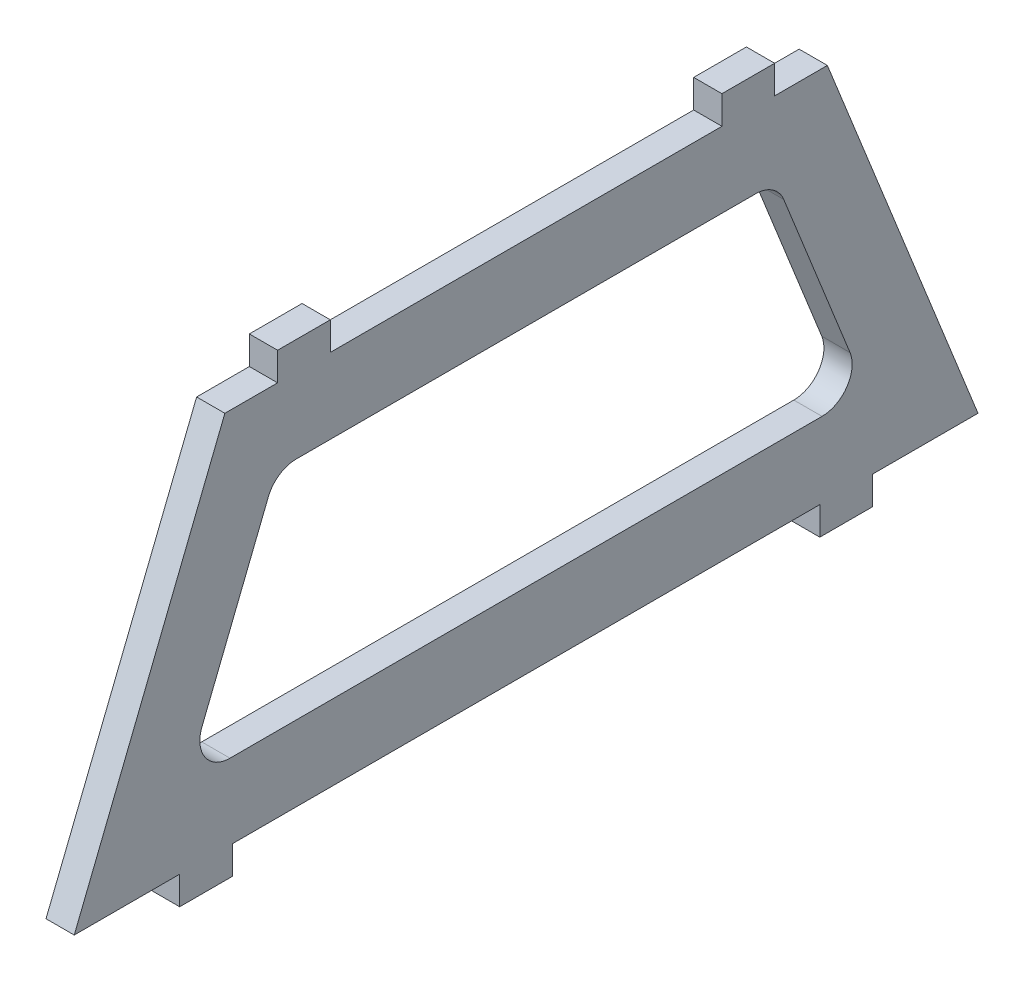
ISO-10303-21;
HEADER;
FILE_DESCRIPTION(('STEP AP214'),'2;1');
FILE_NAME('part.step','',(''),(''),'','','');
FILE_SCHEMA(('AUTOMOTIVE_DESIGN { 1 0 10303 214 1 1 1 1 }'));
ENDSEC;
DATA;
#1=APPLICATION_CONTEXT('core data for automotive mechanical design processes');
#2=APPLICATION_PROTOCOL_DEFINITION('international standard','automotive_design',2000,#1);
#3=PRODUCT_CONTEXT('',#1,'mechanical');
#4=PRODUCT('Part','Part','',(#3));
#5=PRODUCT_RELATED_PRODUCT_CATEGORY('part','',(#4));
#6=PRODUCT_DEFINITION_FORMATION('','',#4);
#7=PRODUCT_DEFINITION_CONTEXT('part definition',#1,'design');
#8=PRODUCT_DEFINITION('design','',#6,#7);
#9=PRODUCT_DEFINITION_SHAPE('','',#8);
#10=(LENGTH_UNIT() NAMED_UNIT(*) SI_UNIT(.MILLI.,.METRE.));
#11=(NAMED_UNIT(*) PLANE_ANGLE_UNIT() SI_UNIT($,.RADIAN.));
#12=(NAMED_UNIT(*) SI_UNIT($,.STERADIAN.) SOLID_ANGLE_UNIT());
#13=UNCERTAINTY_MEASURE_WITH_UNIT(LENGTH_MEASURE(1.E-05),#10,'distance_accuracy_value','');
#14=(GEOMETRIC_REPRESENTATION_CONTEXT(3) GLOBAL_UNCERTAINTY_ASSIGNED_CONTEXT((#13)) GLOBAL_UNIT_ASSIGNED_CONTEXT((#10,
#11,#12)) REPRESENTATION_CONTEXT('',''));
#15=CARTESIAN_POINT('',(0.,0.,0.));
#16=DIRECTION('',(0.,0.,1.));
#17=DIRECTION('',(1.,0.,0.));
#18=AXIS2_PLACEMENT_3D('',#15,#16,#17);
#19=CARTESIAN_POINT('',(4.7625,5.4030853865091E-13,92.7100000000004));
#20=DIRECTION('',(0.,0.,1.));
#21=DIRECTION('',(0.,-1.,0.));
#22=AXIS2_PLACEMENT_3D('',#19,#20,#21);
#23=PLANE('',#22);
#24=DIRECTION('',(0.,1.,0.));
#25=VECTOR('',#24,1.);
#26=CARTESIAN_POINT('',(0.,5.4030853865091E-13,92.7100000000004));
#27=LINE('',#26,#25);
#28=CARTESIAN_POINT('',(0.,63.5,92.71));
#29=VERTEX_POINT('',#28);
#30=CARTESIAN_POINT('',(0.,68.2625,92.71));
#31=VERTEX_POINT('',#30);
#32=EDGE_CURVE('E237',#29,#31,#27,.T.);
#33=ORIENTED_EDGE('',*,*,#32,.F.);
#34=DIRECTION('',(-1.,0.,0.));
#35=VECTOR('',#34,1.);
#36=CARTESIAN_POINT('',(4.7625,63.5,92.71));
#37=LINE('',#36,#35);
#38=CARTESIAN_POINT('',(4.7625,63.5,92.71));
#39=VERTEX_POINT('',#38);
#40=EDGE_CURVE('E231',#39,#29,#37,.T.);
#41=ORIENTED_EDGE('',*,*,#40,.F.);
#42=DIRECTION('',(0.,1.,0.));
#43=VECTOR('',#42,1.);
#44=CARTESIAN_POINT('',(4.7625,5.4030853865091E-13,92.7100000000004));
#45=LINE('',#44,#43);
#46=CARTESIAN_POINT('',(4.7625,68.2625,92.71));
#47=VERTEX_POINT('',#46);
#48=EDGE_CURVE('E234',#39,#47,#45,.T.);
#49=ORIENTED_EDGE('',*,*,#48,.T.);
#50=DIRECTION('',(-1.,0.,0.));
#51=VECTOR('',#50,1.);
#52=CARTESIAN_POINT('',(4.7625,68.2625,92.71));
#53=LINE('',#52,#51);
#54=EDGE_CURVE('E317',#47,#31,#53,.T.);
#55=ORIENTED_EDGE('',*,*,#54,.T.);
#56=EDGE_LOOP('',(#33,#41,#49,#55));
#57=FACE_BOUND('',#56,.T.);
#58=ADVANCED_FACE('F44',(#57),#23,.T.);
#59=CARTESIAN_POINT('',(4.7625,63.5,0.));
#60=DIRECTION('',(0.,-1.,0.));
#61=DIRECTION('',(0.,0.,-1.));
#62=AXIS2_PLACEMENT_3D('',#59,#60,#61);
#63=PLANE('',#62);
#64=DIRECTION('',(0.,0.,1.));
#65=VECTOR('',#64,1.);
#66=CARTESIAN_POINT('',(0.,63.5,0.));
#67=LINE('',#66,#65);
#68=CARTESIAN_POINT('',(0.,63.5,101.6));
#69=VERTEX_POINT('',#68);
#70=EDGE_CURVE('E320',#29,#69,#67,.T.);
#71=ORIENTED_EDGE('',*,*,#70,.T.);
#72=DIRECTION('',(-1.,0.,0.));
#73=VECTOR('',#72,1.);
#74=CARTESIAN_POINT('',(4.7625,63.5,101.6));
#75=LINE('',#74,#73);
#76=CARTESIAN_POINT('',(4.7625,63.5,101.6));
#77=VERTEX_POINT('',#76);
#78=EDGE_CURVE('E242',#77,#69,#75,.T.);
#79=ORIENTED_EDGE('',*,*,#78,.F.);
#80=DIRECTION('',(0.,0.,1.));
#81=VECTOR('',#80,1.);
#82=CARTESIAN_POINT('',(4.7625,63.5,0.));
#83=LINE('',#82,#81);
#84=EDGE_CURVE('E245',#39,#77,#83,.T.);
#85=ORIENTED_EDGE('',*,*,#84,.F.);
#86=ORIENTED_EDGE('',*,*,#40,.T.);
#87=EDGE_LOOP('',(#71,#79,#85,#86));
#88=FACE_BOUND('',#87,.T.);
#89=ADVANCED_FACE('F246',(#88),#63,.F.);
#90=CARTESIAN_POINT('',(4.7625,43.7931034482759,109.48275862069));
#91=DIRECTION('',(0.,-0.371390676354104,-0.928476690885259));
#92=DIRECTION('',(0.,0.928476690885259,-0.371390676354104));
#93=AXIS2_PLACEMENT_3D('',#90,#91,#92);
#94=PLANE('',#93);
#95=DIRECTION('',(0.,-0.928476690885259,0.371390676354104));
#96=VECTOR('',#95,1.);
#97=CARTESIAN_POINT('',(0.,43.7931034482759,109.48275862069));
#98=LINE('',#97,#96);
#99=CARTESIAN_POINT('',(0.,0.,127.));
#100=VERTEX_POINT('',#99);
#101=EDGE_CURVE('E324',#69,#100,#98,.T.);
#102=ORIENTED_EDGE('',*,*,#101,.T.);
#103=DIRECTION('',(-1.,0.,0.));
#104=VECTOR('',#103,1.);
#105=CARTESIAN_POINT('',(4.7625,0.,127.));
#106=LINE('',#105,#104);
#107=CARTESIAN_POINT('',(4.7625,0.,127.));
#108=VERTEX_POINT('',#107);
#109=EDGE_CURVE('E431',#108,#100,#106,.T.);
#110=ORIENTED_EDGE('',*,*,#109,.F.);
#111=DIRECTION('',(0.,-0.928476690885259,0.371390676354104));
#112=VECTOR('',#111,1.);
#113=CARTESIAN_POINT('',(4.7625,43.7931034482759,109.48275862069));
#114=LINE('',#113,#112);
#115=EDGE_CURVE('E251',#77,#108,#114,.T.);
#116=ORIENTED_EDGE('',*,*,#115,.F.);
#117=ORIENTED_EDGE('',*,*,#78,.T.);
#118=EDGE_LOOP('',(#102,#110,#116,#117));
#119=FACE_BOUND('',#118,.T.);
#120=ADVANCED_FACE('F546',(#119),#94,.F.);
#121=CARTESIAN_POINT('',(4.7625,0.,0.));
#122=DIRECTION('',(0.,1.,0.));
#123=DIRECTION('',(0.,0.,1.));
#124=AXIS2_PLACEMENT_3D('',#121,#122,#123);
#125=PLANE('',#124);
#126=DIRECTION('',(0.,0.,-1.));
#127=VECTOR('',#126,1.);
#128=CARTESIAN_POINT('',(0.,0.,0.));
#129=LINE('',#128,#127);
#130=CARTESIAN_POINT('',(0.,0.,109.22));
#131=VERTEX_POINT('',#130);
#132=EDGE_CURVE('E329',#100,#131,#129,.T.);
#133=ORIENTED_EDGE('',*,*,#132,.T.);
#134=DIRECTION('',(-1.,0.,0.));
#135=VECTOR('',#134,1.);
#136=CARTESIAN_POINT('',(4.7625,0.,109.22));
#137=LINE('',#136,#135);
#138=CARTESIAN_POINT('',(4.7625,0.,109.22));
#139=VERTEX_POINT('',#138);
#140=EDGE_CURVE('E427',#139,#131,#137,.T.);
#141=ORIENTED_EDGE('',*,*,#140,.F.);
#142=DIRECTION('',(0.,0.,-1.));
#143=VECTOR('',#142,1.);
#144=CARTESIAN_POINT('',(4.7625,0.,0.));
#145=LINE('',#144,#143);
#146=EDGE_CURVE('E272',#108,#139,#145,.T.);
#147=ORIENTED_EDGE('',*,*,#146,.F.);
#148=ORIENTED_EDGE('',*,*,#109,.T.);
#149=EDGE_LOOP('',(#133,#141,#147,#148));
#150=FACE_BOUND('',#149,.T.);
#151=ADVANCED_FACE('F608',(#150),#125,.F.);
#152=CARTESIAN_POINT('',(4.7625,0.,109.22));
#153=DIRECTION('',(0.,0.,-1.));
#154=DIRECTION('',(-1.,0.,0.));
#155=AXIS2_PLACEMENT_3D('',#152,#153,#154);
#156=PLANE('',#155);
#157=DIRECTION('',(0.,-1.,0.));
#158=VECTOR('',#157,1.);
#159=CARTESIAN_POINT('',(0.,0.,109.22));
#160=LINE('',#159,#158);
#161=CARTESIAN_POINT('',(0.,-4.76250000000002,109.22));
#162=VERTEX_POINT('',#161);
#163=EDGE_CURVE('E332',#131,#162,#160,.T.);
#164=ORIENTED_EDGE('',*,*,#163,.T.);
#165=DIRECTION('',(-1.,0.,0.));
#166=VECTOR('',#165,1.);
#167=CARTESIAN_POINT('',(4.7625,-4.76250000000002,109.22));
#168=LINE('',#167,#166);
#169=CARTESIAN_POINT('',(4.7625,-4.76250000000002,109.22));
#170=VERTEX_POINT('',#169);
#171=EDGE_CURVE('E423',#170,#162,#168,.T.);
#172=ORIENTED_EDGE('',*,*,#171,.F.);
#173=DIRECTION('',(0.,-1.,0.));
#174=VECTOR('',#173,1.);
#175=CARTESIAN_POINT('',(4.7625,0.,109.22));
#176=LINE('',#175,#174);
#177=EDGE_CURVE('E275',#139,#170,#176,.T.);
#178=ORIENTED_EDGE('',*,*,#177,.F.);
#179=ORIENTED_EDGE('',*,*,#140,.T.);
#180=EDGE_LOOP('',(#164,#172,#178,#179));
#181=FACE_BOUND('',#180,.T.);
#182=ADVANCED_FACE('F627',(#181),#156,.F.);
#183=CARTESIAN_POINT('',(4.7625,-4.76250000000002,0.));
#184=DIRECTION('',(0.,1.,0.));
#185=DIRECTION('',(0.,0.,1.));
#186=AXIS2_PLACEMENT_3D('',#183,#184,#185);
#187=PLANE('',#186);
#188=DIRECTION('',(0.,0.,-1.));
#189=VECTOR('',#188,1.);
#190=CARTESIAN_POINT('',(0.,-4.76250000000002,0.));
#191=LINE('',#190,#189);
#192=CARTESIAN_POINT('',(0.,-4.76250000000002,100.33));
#193=VERTEX_POINT('',#192);
#194=EDGE_CURVE('E337',#162,#193,#191,.T.);
#195=ORIENTED_EDGE('',*,*,#194,.T.);
#196=DIRECTION('',(-1.,0.,0.));
#197=VECTOR('',#196,1.);
#198=CARTESIAN_POINT('',(4.7625,-4.76250000000002,100.33));
#199=LINE('',#198,#197);
#200=CARTESIAN_POINT('',(4.7625,-4.76250000000002,100.33));
#201=VERTEX_POINT('',#200);
#202=EDGE_CURVE('E420',#201,#193,#199,.T.);
#203=ORIENTED_EDGE('',*,*,#202,.F.);
#204=DIRECTION('',(0.,0.,-1.));
#205=VECTOR('',#204,1.);
#206=CARTESIAN_POINT('',(4.7625,-4.76250000000002,0.));
#207=LINE('',#206,#205);
#208=EDGE_CURVE('E280',#170,#201,#207,.T.);
#209=ORIENTED_EDGE('',*,*,#208,.F.);
#210=ORIENTED_EDGE('',*,*,#171,.T.);
#211=EDGE_LOOP('',(#195,#203,#209,#210));
#212=FACE_BOUND('',#211,.T.);
#213=ADVANCED_FACE('F624',(#212),#187,.F.);
#214=CARTESIAN_POINT('',(4.7625,-2.92358729817958E-13,100.33));
#215=DIRECTION('',(0.,0.,-1.));
#216=DIRECTION('',(0.,1.,0.));
#217=AXIS2_PLACEMENT_3D('',#214,#215,#216);
#218=PLANE('',#217);
#219=DIRECTION('',(0.,-1.,0.));
#220=VECTOR('',#219,1.);
#221=CARTESIAN_POINT('',(0.,-2.92358729817958E-13,100.33));
#222=LINE('',#221,#220);
#223=CARTESIAN_POINT('',(0.,0.,100.33));
#224=VERTEX_POINT('',#223);
#225=EDGE_CURVE('E341',#224,#193,#222,.T.);
#226=ORIENTED_EDGE('',*,*,#225,.F.);
#227=DIRECTION('',(-1.,0.,0.));
#228=VECTOR('',#227,1.);
#229=CARTESIAN_POINT('',(4.7625,0.,100.33));
#230=LINE('',#229,#228);
#231=CARTESIAN_POINT('',(4.7625,0.,100.33));
#232=VERTEX_POINT('',#231);
#233=EDGE_CURVE('E417',#232,#224,#230,.T.);
#234=ORIENTED_EDGE('',*,*,#233,.F.);
#235=DIRECTION('',(0.,-1.,0.));
#236=VECTOR('',#235,1.);
#237=CARTESIAN_POINT('',(4.7625,-2.92358729817958E-13,100.33));
#238=LINE('',#237,#236);
#239=EDGE_CURVE('E283',#232,#201,#238,.T.);
#240=ORIENTED_EDGE('',*,*,#239,.T.);
#241=ORIENTED_EDGE('',*,*,#202,.T.);
#242=EDGE_LOOP('',(#226,#234,#240,#241));
#243=FACE_BOUND('',#242,.T.);
#244=ADVANCED_FACE('F621',(#243),#218,.T.);
#245=CARTESIAN_POINT('',(0.,0.,1.26999999999999));
#246=VERTEX_POINT('',#245);
#247=EDGE_CURVE('E334',#224,#246,#129,.T.);
#248=ORIENTED_EDGE('',*,*,#247,.T.);
#249=DIRECTION('',(-1.,0.,0.));
#250=VECTOR('',#249,1.);
#251=CARTESIAN_POINT('',(4.7625,0.,1.26999999999999));
#252=LINE('',#251,#250);
#253=CARTESIAN_POINT('',(4.7625,0.,1.26999999999999));
#254=VERTEX_POINT('',#253);
#255=EDGE_CURVE('E413',#254,#246,#252,.T.);
#256=ORIENTED_EDGE('',*,*,#255,.F.);
#257=EDGE_CURVE('E277',#232,#254,#145,.T.);
#258=ORIENTED_EDGE('',*,*,#257,.F.);
#259=ORIENTED_EDGE('',*,*,#233,.T.);
#260=EDGE_LOOP('',(#248,#256,#258,#259));
#261=FACE_BOUND('',#260,.T.);
#262=ADVANCED_FACE('F609',(#261),#125,.F.);
#263=CARTESIAN_POINT('',(4.7625,0.,1.26999999999999));
#264=DIRECTION('',(0.,0.,-1.));
#265=DIRECTION('',(-1.,0.,0.));
#266=AXIS2_PLACEMENT_3D('',#263,#264,#265);
#267=PLANE('',#266);
#268=DIRECTION('',(0.,-1.,0.));
#269=VECTOR('',#268,1.);
#270=CARTESIAN_POINT('',(0.,0.,1.26999999999999));
#271=LINE('',#270,#269);
#272=CARTESIAN_POINT('',(0.,-4.7625,1.26999999999999));
#273=VERTEX_POINT('',#272);
#274=EDGE_CURVE('E345',#246,#273,#271,.T.);
#275=ORIENTED_EDGE('',*,*,#274,.T.);
#276=DIRECTION('',(-1.,0.,0.));
#277=VECTOR('',#276,1.);
#278=CARTESIAN_POINT('',(4.7625,-4.7625,1.26999999999999));
#279=LINE('',#278,#277);
#280=CARTESIAN_POINT('',(4.7625,-4.7625,1.26999999999999));
#281=VERTEX_POINT('',#280);
#282=EDGE_CURVE('E410',#281,#273,#279,.T.);
#283=ORIENTED_EDGE('',*,*,#282,.F.);
#284=DIRECTION('',(0.,-1.,0.));
#285=VECTOR('',#284,1.);
#286=CARTESIAN_POINT('',(4.7625,0.,1.26999999999999));
#287=LINE('',#286,#285);
#288=EDGE_CURVE('E287',#254,#281,#287,.T.);
#289=ORIENTED_EDGE('',*,*,#288,.F.);
#290=ORIENTED_EDGE('',*,*,#255,.T.);
#291=EDGE_LOOP('',(#275,#283,#289,#290));
#292=FACE_BOUND('',#291,.T.);
#293=ADVANCED_FACE('F616',(#292),#267,.F.);
#294=CARTESIAN_POINT('',(4.7625,-4.7625,0.));
#295=DIRECTION('',(0.,-1.,0.));
#296=DIRECTION('',(0.,0.,-1.));
#297=AXIS2_PLACEMENT_3D('',#294,#295,#296);
#298=PLANE('',#297);
#299=DIRECTION('',(0.,0.,1.));
#300=VECTOR('',#299,1.);
#301=CARTESIAN_POINT('',(0.,-4.7625,0.));
#302=LINE('',#301,#300);
#303=CARTESIAN_POINT('',(0.,-4.7625,-7.62));
#304=VERTEX_POINT('',#303);
#305=EDGE_CURVE('E349',#304,#273,#302,.T.);
#306=ORIENTED_EDGE('',*,*,#305,.F.);
#307=DIRECTION('',(-1.,0.,0.));
#308=VECTOR('',#307,1.);
#309=CARTESIAN_POINT('',(4.7625,-4.7625,-7.62));
#310=LINE('',#309,#308);
#311=CARTESIAN_POINT('',(4.7625,-4.7625,-7.62));
#312=VERTEX_POINT('',#311);
#313=EDGE_CURVE('E407',#312,#304,#310,.T.);
#314=ORIENTED_EDGE('',*,*,#313,.F.);
#315=DIRECTION('',(0.,0.,1.));
#316=VECTOR('',#315,1.);
#317=CARTESIAN_POINT('',(4.7625,-4.7625,0.));
#318=LINE('',#317,#316);
#319=EDGE_CURVE('E290',#312,#281,#318,.T.);
#320=ORIENTED_EDGE('',*,*,#319,.T.);
#321=ORIENTED_EDGE('',*,*,#282,.T.);
#322=EDGE_LOOP('',(#306,#314,#320,#321));
#323=FACE_BOUND('',#322,.T.);
#324=ADVANCED_FACE('F612',(#323),#298,.T.);
#325=CARTESIAN_POINT('',(4.7625,0.,-7.61999999999999));
#326=DIRECTION('',(0.,0.,-1.));
#327=DIRECTION('',(0.,1.,0.));
#328=AXIS2_PLACEMENT_3D('',#325,#326,#327);
#329=PLANE('',#328);
#330=DIRECTION('',(0.,-1.,0.));
#331=VECTOR('',#330,1.);
#332=CARTESIAN_POINT('',(0.,0.,-7.61999999999999));
#333=LINE('',#332,#331);
#334=CARTESIAN_POINT('',(0.,0.,-7.61999999999999));
#335=VERTEX_POINT('',#334);
#336=EDGE_CURVE('E353',#335,#304,#333,.T.);
#337=ORIENTED_EDGE('',*,*,#336,.F.);
#338=DIRECTION('',(-1.,0.,0.));
#339=VECTOR('',#338,1.);
#340=CARTESIAN_POINT('',(4.7625,0.,-7.61999999999999));
#341=LINE('',#340,#339);
#342=CARTESIAN_POINT('',(4.7625,0.,-7.61999999999999));
#343=VERTEX_POINT('',#342);
#344=EDGE_CURVE('E404',#343,#335,#341,.T.);
#345=ORIENTED_EDGE('',*,*,#344,.F.);
#346=DIRECTION('',(0.,-1.,0.));
#347=VECTOR('',#346,1.);
#348=CARTESIAN_POINT('',(4.7625,0.,-7.61999999999999));
#349=LINE('',#348,#347);
#350=EDGE_CURVE('E294',#343,#312,#349,.T.);
#351=ORIENTED_EDGE('',*,*,#350,.T.);
#352=ORIENTED_EDGE('',*,*,#313,.T.);
#353=EDGE_LOOP('',(#337,#345,#351,#352));
#354=FACE_BOUND('',#353,.T.);
#355=ADVANCED_FACE('F606',(#354),#329,.T.);
#356=CARTESIAN_POINT('',(0.,0.,-25.4));
#357=VERTEX_POINT('',#356);
#358=EDGE_CURVE('E333',#335,#357,#129,.T.);
#359=ORIENTED_EDGE('',*,*,#358,.T.);
#360=DIRECTION('',(-1.,0.,0.));
#361=VECTOR('',#360,1.);
#362=CARTESIAN_POINT('',(4.7625,0.,-25.4));
#363=LINE('',#362,#361);
#364=CARTESIAN_POINT('',(4.7625,0.,-25.4));
#365=VERTEX_POINT('',#364);
#366=EDGE_CURVE('E401',#365,#357,#363,.T.);
#367=ORIENTED_EDGE('',*,*,#366,.F.);
#368=EDGE_CURVE('E276',#343,#365,#145,.T.);
#369=ORIENTED_EDGE('',*,*,#368,.F.);
#370=ORIENTED_EDGE('',*,*,#344,.T.);
#371=EDGE_LOOP('',(#359,#367,#369,#370));
#372=FACE_BOUND('',#371,.T.);
#373=ADVANCED_FACE('F602',(#372),#125,.F.);
#374=CARTESIAN_POINT('',(4.7625,8.75862068965517,-21.8965517241379));
#375=DIRECTION('',(0.,0.371390676354104,-0.928476690885259));
#376=DIRECTION('',(0.,0.92847669088526,0.371390676354104));
#377=AXIS2_PLACEMENT_3D('',#374,#375,#376);
#378=PLANE('',#377);
#379=DIRECTION('',(0.,-0.928476690885259,-0.371390676354104));
#380=VECTOR('',#379,1.);
#381=CARTESIAN_POINT('',(0.,8.75862068965517,-21.8965517241379));
#382=LINE('',#381,#380);
#383=CARTESIAN_POINT('',(0.,63.5,0.));
#384=VERTEX_POINT('',#383);
#385=EDGE_CURVE('E357',#384,#357,#382,.T.);
#386=ORIENTED_EDGE('',*,*,#385,.F.);
#387=DIRECTION('',(-1.,0.,0.));
#388=VECTOR('',#387,1.);
#389=CARTESIAN_POINT('',(4.7625,63.5,0.));
#390=LINE('',#389,#388);
#391=CARTESIAN_POINT('',(4.7625,63.5,0.));
#392=VERTEX_POINT('',#391);
#393=EDGE_CURVE('E398',#392,#384,#390,.T.);
#394=ORIENTED_EDGE('',*,*,#393,.F.);
#395=DIRECTION('',(0.,-0.928476690885259,-0.371390676354104));
#396=VECTOR('',#395,1.);
#397=CARTESIAN_POINT('',(4.7625,8.75862068965517,-21.8965517241379));
#398=LINE('',#397,#396);
#399=EDGE_CURVE('E298',#392,#365,#398,.T.);
#400=ORIENTED_EDGE('',*,*,#399,.T.);
#401=ORIENTED_EDGE('',*,*,#366,.T.);
#402=EDGE_LOOP('',(#386,#394,#400,#401));
#403=FACE_BOUND('',#402,.T.);
#404=ADVANCED_FACE('F599',(#403),#378,.T.);
#405=CARTESIAN_POINT('',(0.,63.5,8.88999999999997));
#406=VERTEX_POINT('',#405);
#407=EDGE_CURVE('E326',#384,#406,#67,.T.);
#408=ORIENTED_EDGE('',*,*,#407,.T.);
#409=DIRECTION('',(-1.,0.,0.));
#410=VECTOR('',#409,1.);
#411=CARTESIAN_POINT('',(4.7625,63.5,8.88999999999997));
#412=LINE('',#411,#410);
#413=CARTESIAN_POINT('',(4.7625,63.5,8.88999999999997));
#414=VERTEX_POINT('',#413);
#415=EDGE_CURVE('E394',#414,#406,#412,.T.);
#416=ORIENTED_EDGE('',*,*,#415,.F.);
#417=EDGE_CURVE('E254',#392,#414,#83,.T.);
#418=ORIENTED_EDGE('',*,*,#417,.F.);
#419=ORIENTED_EDGE('',*,*,#393,.T.);
#420=EDGE_LOOP('',(#408,#416,#418,#419));
#421=FACE_BOUND('',#420,.T.);
#422=ADVANCED_FACE('F548',(#421),#63,.F.);
#423=CARTESIAN_POINT('',(4.7625,0.,8.8899999999996));
#424=DIRECTION('',(0.,0.,1.));
#425=DIRECTION('',(0.,-1.,0.));
#426=AXIS2_PLACEMENT_3D('',#423,#424,#425);
#427=PLANE('',#426);
#428=DIRECTION('',(0.,1.,0.));
#429=VECTOR('',#428,1.);
#430=CARTESIAN_POINT('',(0.,0.,8.8899999999996));
#431=LINE('',#430,#429);
#432=CARTESIAN_POINT('',(0.,68.2625,8.89));
#433=VERTEX_POINT('',#432);
#434=EDGE_CURVE('E361',#406,#433,#431,.T.);
#435=ORIENTED_EDGE('',*,*,#434,.T.);
#436=DIRECTION('',(-1.,0.,0.));
#437=VECTOR('',#436,1.);
#438=CARTESIAN_POINT('',(4.7625,68.2625,8.89));
#439=LINE('',#438,#437);
#440=CARTESIAN_POINT('',(4.7625,68.2625,8.89));
#441=VERTEX_POINT('',#440);
#442=EDGE_CURVE('E390',#441,#433,#439,.T.);
#443=ORIENTED_EDGE('',*,*,#442,.F.);
#444=DIRECTION('',(0.,1.,0.));
#445=VECTOR('',#444,1.);
#446=CARTESIAN_POINT('',(4.7625,0.,8.8899999999996));
#447=LINE('',#446,#445);
#448=EDGE_CURVE('E302',#414,#441,#447,.T.);
#449=ORIENTED_EDGE('',*,*,#448,.F.);
#450=ORIENTED_EDGE('',*,*,#415,.T.);
#451=EDGE_LOOP('',(#435,#443,#449,#450));
#452=FACE_BOUND('',#451,.T.);
#453=ADVANCED_FACE('F594',(#452),#427,.F.);
#454=CARTESIAN_POINT('',(4.7625,68.2625,0.));
#455=DIRECTION('',(0.,-1.,0.));
#456=DIRECTION('',(0.,0.,-1.));
#457=AXIS2_PLACEMENT_3D('',#454,#455,#456);
#458=PLANE('',#457);
#459=DIRECTION('',(0.,0.,1.));
#460=VECTOR('',#459,1.);
#461=CARTESIAN_POINT('',(0.,68.2625,0.));
#462=LINE('',#461,#460);
#463=CARTESIAN_POINT('',(0.,68.2625,17.78));
#464=VERTEX_POINT('',#463);
#465=EDGE_CURVE('E364',#433,#464,#462,.T.);
#466=ORIENTED_EDGE('',*,*,#465,.T.);
#467=DIRECTION('',(-1.,0.,0.));
#468=VECTOR('',#467,1.);
#469=CARTESIAN_POINT('',(4.7625,68.2625,17.78));
#470=LINE('',#469,#468);
#471=CARTESIAN_POINT('',(4.7625,68.2625,17.78));
#472=VERTEX_POINT('',#471);
#473=EDGE_CURVE('E387',#472,#464,#470,.T.);
#474=ORIENTED_EDGE('',*,*,#473,.F.);
#475=DIRECTION('',(0.,0.,1.));
#476=VECTOR('',#475,1.);
#477=CARTESIAN_POINT('',(4.7625,68.2625,0.));
#478=LINE('',#477,#476);
#479=EDGE_CURVE('E305',#441,#472,#478,.T.);
#480=ORIENTED_EDGE('',*,*,#479,.F.);
#481=ORIENTED_EDGE('',*,*,#442,.T.);
#482=EDGE_LOOP('',(#466,#474,#480,#481));
#483=FACE_BOUND('',#482,.T.);
#484=ADVANCED_FACE('F590',(#483),#458,.F.);
#485=CARTESIAN_POINT('',(4.7625,-1.03620815631678E-13,17.7799999999996));
#486=DIRECTION('',(0.,0.,1.));
#487=DIRECTION('',(0.,-1.,0.));
#488=AXIS2_PLACEMENT_3D('',#485,#486,#487);
#489=PLANE('',#488);
#490=DIRECTION('',(0.,1.,0.));
#491=VECTOR('',#490,1.);
#492=CARTESIAN_POINT('',(0.,-1.03620815631678E-13,17.7799999999996));
#493=LINE('',#492,#491);
#494=CARTESIAN_POINT('',(0.,63.5,17.78));
#495=VERTEX_POINT('',#494);
#496=EDGE_CURVE('E368',#495,#464,#493,.T.);
#497=ORIENTED_EDGE('',*,*,#496,.F.);
#498=DIRECTION('',(-1.,0.,0.));
#499=VECTOR('',#498,1.);
#500=CARTESIAN_POINT('',(4.7625,63.5,17.78));
#501=LINE('',#500,#499);
#502=CARTESIAN_POINT('',(4.7625,63.5,17.78));
#503=VERTEX_POINT('',#502);
#504=EDGE_CURVE('E384',#503,#495,#501,.T.);
#505=ORIENTED_EDGE('',*,*,#504,.F.);
#506=DIRECTION('',(0.,1.,0.));
#507=VECTOR('',#506,1.);
#508=CARTESIAN_POINT('',(4.7625,-1.03620815631678E-13,17.7799999999996));
#509=LINE('',#508,#507);
#510=EDGE_CURVE('E308',#503,#472,#509,.T.);
#511=ORIENTED_EDGE('',*,*,#510,.T.);
#512=ORIENTED_EDGE('',*,*,#473,.T.);
#513=EDGE_LOOP('',(#497,#505,#511,#512));
#514=FACE_BOUND('',#513,.T.);
#515=ADVANCED_FACE('F586',(#514),#489,.T.);
#516=CARTESIAN_POINT('',(0.,63.5,83.82));
#517=VERTEX_POINT('',#516);
#518=EDGE_CURVE('E325',#495,#517,#67,.T.);
#519=ORIENTED_EDGE('',*,*,#518,.T.);
#520=DIRECTION('',(-1.,0.,0.));
#521=VECTOR('',#520,1.);
#522=CARTESIAN_POINT('',(4.7625,63.5,83.82));
#523=LINE('',#522,#521);
#524=CARTESIAN_POINT('',(4.7625,63.5,83.82));
#525=VERTEX_POINT('',#524);
#526=EDGE_CURVE('E380',#525,#517,#523,.T.);
#527=ORIENTED_EDGE('',*,*,#526,.F.);
#528=EDGE_CURVE('E253',#503,#525,#83,.T.);
#529=ORIENTED_EDGE('',*,*,#528,.F.);
#530=ORIENTED_EDGE('',*,*,#504,.T.);
#531=EDGE_LOOP('',(#519,#527,#529,#530));
#532=FACE_BOUND('',#531,.T.);
#533=ADVANCED_FACE('F549',(#532),#63,.F.);
#534=CARTESIAN_POINT('',(4.7625,4.88498130835069E-13,83.8200000000004));
#535=DIRECTION('',(0.,0.,1.));
#536=DIRECTION('',(0.,-1.,0.));
#537=AXIS2_PLACEMENT_3D('',#534,#535,#536);
#538=PLANE('',#537);
#539=DIRECTION('',(0.,1.,0.));
#540=VECTOR('',#539,1.);
#541=CARTESIAN_POINT('',(0.,4.88498130835069E-13,83.8200000000004));
#542=LINE('',#541,#540);
#543=CARTESIAN_POINT('',(0.,68.2625,83.82));
#544=VERTEX_POINT('',#543);
#545=EDGE_CURVE('E264',#517,#544,#542,.T.);
#546=ORIENTED_EDGE('',*,*,#545,.T.);
#547=DIRECTION('',(-1.,0.,0.));
#548=VECTOR('',#547,1.);
#549=CARTESIAN_POINT('',(4.7625,68.2625,83.82));
#550=LINE('',#549,#548);
#551=CARTESIAN_POINT('',(4.7625,68.2625,83.82));
#552=VERTEX_POINT('',#551);
#553=EDGE_CURVE('E377',#552,#544,#550,.T.);
#554=ORIENTED_EDGE('',*,*,#553,.F.);
#555=DIRECTION('',(0.,1.,0.));
#556=VECTOR('',#555,1.);
#557=CARTESIAN_POINT('',(4.7625,4.88498130835069E-13,83.8200000000004));
#558=LINE('',#557,#556);
#559=EDGE_CURVE('E312',#525,#552,#558,.T.);
#560=ORIENTED_EDGE('',*,*,#559,.F.);
#561=ORIENTED_EDGE('',*,*,#526,.T.);
#562=EDGE_LOOP('',(#546,#554,#560,#561));
#563=FACE_BOUND('',#562,.T.);
#564=ADVANCED_FACE('F580',(#563),#538,.F.);
#565=CARTESIAN_POINT('',(4.7625,68.2625,0.));
#566=DIRECTION('',(0.,1.,0.));
#567=DIRECTION('',(0.,0.,1.));
#568=AXIS2_PLACEMENT_3D('',#565,#566,#567);
#569=PLANE('',#568);
#570=DIRECTION('',(0.,0.,-1.));
#571=VECTOR('',#570,1.);
#572=CARTESIAN_POINT('',(0.,68.2625,0.));
#573=LINE('',#572,#571);
#574=EDGE_CURVE('E259',#31,#544,#573,.T.);
#575=ORIENTED_EDGE('',*,*,#574,.F.);
#576=ORIENTED_EDGE('',*,*,#54,.F.);
#577=DIRECTION('',(0.,0.,-1.));
#578=VECTOR('',#577,1.);
#579=CARTESIAN_POINT('',(4.7625,68.2625,0.));
#580=LINE('',#579,#578);
#581=EDGE_CURVE('E257',#47,#552,#580,.T.);
#582=ORIENTED_EDGE('',*,*,#581,.T.);
#583=ORIENTED_EDGE('',*,*,#553,.T.);
#584=EDGE_LOOP('',(#575,#576,#582,#583));
#585=FACE_BOUND('',#584,.T.);
#586=ADVANCED_FACE('F575',(#585),#569,.T.);
#587=CARTESIAN_POINT('',(4.7625,0.,0.));
#588=DIRECTION('',(1.,0.,0.));
#589=DIRECTION('',(0.,0.,-1.));
#590=AXIS2_PLACEMENT_3D('',#587,#588,#589);
#591=PLANE('',#590);
#592=DIRECTION('',(0.,-0.928476690885259,0.371390676354104));
#593=VECTOR('',#592,1.);
#594=CARTESIAN_POINT('',(4.7625,39.0764418585788,97.6911046464469));
#595=LINE('',#594,#593);
#596=CARTESIAN_POINT('',(4.7625,47.6066646358789,94.2790155355268));
#597=VERTEX_POINT('',#596);
#598=CARTESIAN_POINT('',(4.7625,19.6666646358788,105.455015535527));
#599=VERTEX_POINT('',#598);
#600=EDGE_CURVE('E485',#597,#599,#595,.T.);
#601=ORIENTED_EDGE('',*,*,#600,.F.);
#602=CARTESIAN_POINT('',(4.7625,45.72,89.5623539458297));
#603=DIRECTION('',(1.,0.,0.));
#604=DIRECTION('',(0.,0.,-1.));
#605=AXIS2_PLACEMENT_3D('',#602,#603,#604);
#606=CIRCLE('',#605,5.08);
#607=CARTESIAN_POINT('',(4.7625,50.8,89.5623539458297));
#608=VERTEX_POINT('',#607);
#609=EDGE_CURVE('E53',#597,#608,#606,.F.);
#610=ORIENTED_EDGE('',*,*,#609,.T.);
#611=DIRECTION('',(0.,0.,-1.));
#612=VECTOR('',#611,1.);
#613=CARTESIAN_POINT('',(4.7625,50.8,0.));
#614=LINE('',#613,#612);
#615=CARTESIAN_POINT('',(4.7625,50.8,12.0753274440487));
#616=VERTEX_POINT('',#615);
#617=EDGE_CURVE('E267',#608,#616,#614,.T.);
#618=ORIENTED_EDGE('',*,*,#617,.T.);
#619=CARTESIAN_POINT('',(4.7625,45.72,12.0753274440487));
#620=DIRECTION('',(1.,0.,0.));
#621=DIRECTION('',(0.,0.,-1.));
#622=AXIS2_PLACEMENT_3D('',#619,#620,#621);
#623=CIRCLE('',#622,5.08);
#624=CARTESIAN_POINT('',(4.7625,47.6066646358789,7.35866585435154));
#625=VERTEX_POINT('',#624);
#626=EDGE_CURVE('E475',#616,#625,#623,.F.);
#627=ORIENTED_EDGE('',*,*,#626,.T.);
#628=DIRECTION('',(0.,-0.928476690885259,-0.371390676354104));
#629=VECTOR('',#628,1.);
#630=CARTESIAN_POINT('',(4.7625,4.02896551724139,-10.0724137931035));
#631=LINE('',#630,#629);
#632=CARTESIAN_POINT('',(4.7625,19.6666646358788,-3.81733414564847));
#633=VERTEX_POINT('',#632);
#634=EDGE_CURVE('E492',#625,#633,#631,.T.);
#635=ORIENTED_EDGE('',*,*,#634,.T.);
#636=CARTESIAN_POINT('',(4.7625,17.78,0.899327444048643));
#637=DIRECTION('',(1.,0.,0.));
#638=DIRECTION('',(0.,0.,-1.));
#639=AXIS2_PLACEMENT_3D('',#636,#637,#638);
#640=CIRCLE('',#639,5.08);
#641=CARTESIAN_POINT('',(4.7625,12.7,0.899327444048643));
#642=VERTEX_POINT('',#641);
#643=EDGE_CURVE('E469',#633,#642,#640,.F.);
#644=ORIENTED_EDGE('',*,*,#643,.T.);
#645=DIRECTION('',(0.,0.,-1.));
#646=VECTOR('',#645,1.);
#647=CARTESIAN_POINT('',(4.7625,12.7,0.));
#648=LINE('',#647,#646);
#649=CARTESIAN_POINT('',(4.7625,12.7,100.73835394583));
#650=VERTEX_POINT('',#649);
#651=EDGE_CURVE('E518',#650,#642,#648,.T.);
#652=ORIENTED_EDGE('',*,*,#651,.F.);
#653=CARTESIAN_POINT('',(4.7625,17.78,100.73835394583));
#654=DIRECTION('',(1.,0.,0.));
#655=DIRECTION('',(0.,0.,-1.));
#656=AXIS2_PLACEMENT_3D('',#653,#654,#655);
#657=CIRCLE('',#656,5.08);
#658=EDGE_CURVE('E463',#650,#599,#657,.F.);
#659=ORIENTED_EDGE('',*,*,#658,.T.);
#660=EDGE_LOOP('',(#601,#610,#618,#627,#635,#644,#652,#659));
#661=FACE_BOUND('',#660,.T.);
#662=ORIENTED_EDGE('',*,*,#48,.F.);
#663=ORIENTED_EDGE('',*,*,#84,.T.);
#664=ORIENTED_EDGE('',*,*,#115,.T.);
#665=ORIENTED_EDGE('',*,*,#146,.T.);
#666=ORIENTED_EDGE('',*,*,#177,.T.);
#667=ORIENTED_EDGE('',*,*,#208,.T.);
#668=ORIENTED_EDGE('',*,*,#239,.F.);
#669=ORIENTED_EDGE('',*,*,#257,.T.);
#670=ORIENTED_EDGE('',*,*,#288,.T.);
#671=ORIENTED_EDGE('',*,*,#319,.F.);
#672=ORIENTED_EDGE('',*,*,#350,.F.);
#673=ORIENTED_EDGE('',*,*,#368,.T.);
#674=ORIENTED_EDGE('',*,*,#399,.F.);
#675=ORIENTED_EDGE('',*,*,#417,.T.);
#676=ORIENTED_EDGE('',*,*,#448,.T.);
#677=ORIENTED_EDGE('',*,*,#479,.T.);
#678=ORIENTED_EDGE('',*,*,#510,.F.);
#679=ORIENTED_EDGE('',*,*,#528,.T.);
#680=ORIENTED_EDGE('',*,*,#559,.T.);
#681=ORIENTED_EDGE('',*,*,#581,.F.);
#682=EDGE_LOOP('',(#662,#663,#664,#665,#666,#667,#668,#669,#670,#671,#672,#673,#674,#675,#676,
#677,#678,#679,#680,#681));
#683=FACE_BOUND('',#682,.T.);
#684=ADVANCED_FACE('F255',(#661,#683),#591,.T.);
#685=CARTESIAN_POINT('',(0.,0.,0.));
#686=DIRECTION('',(1.,0.,0.));
#687=DIRECTION('',(0.,0.,-1.));
#688=AXIS2_PLACEMENT_3D('',#685,#686,#687);
#689=PLANE('',#688);
#690=DIRECTION('',(0.,0.,-1.));
#691=VECTOR('',#690,1.);
#692=CARTESIAN_POINT('',(0.,50.8,0.));
#693=LINE('',#692,#691);
#694=CARTESIAN_POINT('',(0.,50.8,89.5623539458297));
#695=VERTEX_POINT('',#694);
#696=CARTESIAN_POINT('',(0.,50.8,12.0753274440487));
#697=VERTEX_POINT('',#696);
#698=EDGE_CURVE('E321',#695,#697,#693,.T.);
#699=ORIENTED_EDGE('',*,*,#698,.F.);
#700=CARTESIAN_POINT('',(0.,45.72,89.5623539458297));
#701=DIRECTION('',(1.,0.,0.));
#702=DIRECTION('',(0.,0.,-1.));
#703=AXIS2_PLACEMENT_3D('',#700,#701,#702);
#704=CIRCLE('',#703,5.08);
#705=CARTESIAN_POINT('',(0.,47.6066646358789,94.2790155355268));
#706=VERTEX_POINT('',#705);
#707=EDGE_CURVE('E11',#695,#706,#704,.T.);
#708=ORIENTED_EDGE('',*,*,#707,.T.);
#709=DIRECTION('',(0.,-0.928476690885259,0.371390676354104));
#710=VECTOR('',#709,1.);
#711=CARTESIAN_POINT('',(0.,39.0764418585788,97.6911046464469));
#712=LINE('',#711,#710);
#713=CARTESIAN_POINT('',(0.,19.6666646358788,105.455015535527));
#714=VERTEX_POINT('',#713);
#715=EDGE_CURVE('E491',#706,#714,#712,.T.);
#716=ORIENTED_EDGE('',*,*,#715,.T.);
#717=CARTESIAN_POINT('',(0.,17.78,100.73835394583));
#718=DIRECTION('',(1.,0.,0.));
#719=DIRECTION('',(0.,0.,-1.));
#720=AXIS2_PLACEMENT_3D('',#717,#718,#719);
#721=CIRCLE('',#720,5.08);
#722=CARTESIAN_POINT('',(0.,12.7,100.73835394583));
#723=VERTEX_POINT('',#722);
#724=EDGE_CURVE('E466',#714,#723,#721,.T.);
#725=ORIENTED_EDGE('',*,*,#724,.T.);
#726=DIRECTION('',(0.,0.,-1.));
#727=VECTOR('',#726,1.);
#728=CARTESIAN_POINT('',(0.,12.7,0.));
#729=LINE('',#728,#727);
#730=CARTESIAN_POINT('',(0.,12.7,0.899327444048643));
#731=VERTEX_POINT('',#730);
#732=EDGE_CURVE('E503',#723,#731,#729,.T.);
#733=ORIENTED_EDGE('',*,*,#732,.T.);
#734=CARTESIAN_POINT('',(0.,17.78,0.899327444048643));
#735=DIRECTION('',(1.,0.,0.));
#736=DIRECTION('',(0.,0.,-1.));
#737=AXIS2_PLACEMENT_3D('',#734,#735,#736);
#738=CIRCLE('',#737,5.08);
#739=CARTESIAN_POINT('',(0.,19.6666646358788,-3.81733414564847));
#740=VERTEX_POINT('',#739);
#741=EDGE_CURVE('E472',#731,#740,#738,.T.);
#742=ORIENTED_EDGE('',*,*,#741,.T.);
#743=DIRECTION('',(0.,-0.928476690885259,-0.371390676354104));
#744=VECTOR('',#743,1.);
#745=CARTESIAN_POINT('',(0.,4.02896551724139,-10.0724137931035));
#746=LINE('',#745,#744);
#747=CARTESIAN_POINT('',(0.,47.6066646358789,7.35866585435154));
#748=VERTEX_POINT('',#747);
#749=EDGE_CURVE('E508',#748,#740,#746,.T.);
#750=ORIENTED_EDGE('',*,*,#749,.F.);
#751=CARTESIAN_POINT('',(0.,45.72,12.0753274440487));
#752=DIRECTION('',(1.,0.,0.));
#753=DIRECTION('',(0.,0.,-1.));
#754=AXIS2_PLACEMENT_3D('',#751,#752,#753);
#755=CIRCLE('',#754,5.08);
#756=EDGE_CURVE('E60',#748,#697,#755,.T.);
#757=ORIENTED_EDGE('',*,*,#756,.T.);
#758=EDGE_LOOP('',(#699,#708,#716,#725,#733,#742,#750,#757));
#759=FACE_BOUND('',#758,.T.);
#760=ORIENTED_EDGE('',*,*,#32,.T.);
#761=ORIENTED_EDGE('',*,*,#574,.T.);
#762=ORIENTED_EDGE('',*,*,#545,.F.);
#763=ORIENTED_EDGE('',*,*,#518,.F.);
#764=ORIENTED_EDGE('',*,*,#496,.T.);
#765=ORIENTED_EDGE('',*,*,#465,.F.);
#766=ORIENTED_EDGE('',*,*,#434,.F.);
#767=ORIENTED_EDGE('',*,*,#407,.F.);
#768=ORIENTED_EDGE('',*,*,#385,.T.);
#769=ORIENTED_EDGE('',*,*,#358,.F.);
#770=ORIENTED_EDGE('',*,*,#336,.T.);
#771=ORIENTED_EDGE('',*,*,#305,.T.);
#772=ORIENTED_EDGE('',*,*,#274,.F.);
#773=ORIENTED_EDGE('',*,*,#247,.F.);
#774=ORIENTED_EDGE('',*,*,#225,.T.);
#775=ORIENTED_EDGE('',*,*,#194,.F.);
#776=ORIENTED_EDGE('',*,*,#163,.F.);
#777=ORIENTED_EDGE('',*,*,#132,.F.);
#778=ORIENTED_EDGE('',*,*,#101,.F.);
#779=ORIENTED_EDGE('',*,*,#70,.F.);
#780=EDGE_LOOP('',(#760,#761,#762,#763,#764,#765,#766,#767,#768,#769,#770,#771,#772,#773,#774,
#775,#776,#777,#778,#779));
#781=FACE_BOUND('',#780,.T.);
#782=ADVANCED_FACE('F496',(#759,#781),#689,.F.);
#783=CARTESIAN_POINT('',(0.,39.0764418585788,97.6911046464469));
#784=DIRECTION('',(0.,0.371390676354104,0.928476690885259));
#785=DIRECTION('',(0.,-0.928476690885259,0.371390676354104));
#786=AXIS2_PLACEMENT_3D('',#783,#784,#785);
#787=PLANE('',#786);
#788=ORIENTED_EDGE('',*,*,#600,.T.);
#789=DIRECTION('',(1.,0.,0.));
#790=VECTOR('',#789,1.);
#791=CARTESIAN_POINT('',(0.,19.6666646358788,105.455015535527));
#792=LINE('',#791,#790);
#793=EDGE_CURVE('E447',#599,#714,#792,.F.);
#794=ORIENTED_EDGE('',*,*,#793,.T.);
#795=ORIENTED_EDGE('',*,*,#715,.F.);
#796=DIRECTION('',(1.,0.,0.));
#797=VECTOR('',#796,1.);
#798=CARTESIAN_POINT('',(0.,47.6066646358789,94.2790155355268));
#799=LINE('',#798,#797);
#800=EDGE_CURVE('E443',#706,#597,#799,.T.);
#801=ORIENTED_EDGE('',*,*,#800,.T.);
#802=EDGE_LOOP('',(#788,#794,#795,#801));
#803=FACE_BOUND('',#802,.T.);
#804=ADVANCED_FACE('F500',(#803),#787,.F.);
#805=CARTESIAN_POINT('',(0.,50.8,0.));
#806=DIRECTION('',(0.,-1.,0.));
#807=DIRECTION('',(0.,0.,-1.));
#808=AXIS2_PLACEMENT_3D('',#805,#806,#807);
#809=PLANE('',#808);
#810=ORIENTED_EDGE('',*,*,#698,.T.);
#811=DIRECTION('',(1.,0.,0.));
#812=VECTOR('',#811,1.);
#813=CARTESIAN_POINT('',(4.7625,50.8,12.0753274440487));
#814=LINE('',#813,#812);
#815=EDGE_CURVE('E459',#697,#616,#814,.T.);
#816=ORIENTED_EDGE('',*,*,#815,.T.);
#817=ORIENTED_EDGE('',*,*,#617,.F.);
#818=DIRECTION('',(1.,0.,0.));
#819=VECTOR('',#818,1.);
#820=CARTESIAN_POINT('',(0.,50.8,89.5623539458297));
#821=LINE('',#820,#819);
#822=EDGE_CURVE('E67',#608,#695,#821,.F.);
#823=ORIENTED_EDGE('',*,*,#822,.T.);
#824=EDGE_LOOP('',(#810,#816,#817,#823));
#825=FACE_BOUND('',#824,.T.);
#826=ADVANCED_FACE('F488',(#825),#809,.T.);
#827=CARTESIAN_POINT('',(0.,4.02896551724139,-10.0724137931035));
#828=DIRECTION('',(0.,-0.371390676354104,0.928476690885259));
#829=DIRECTION('',(0.,-0.928476690885259,-0.371390676354104));
#830=AXIS2_PLACEMENT_3D('',#827,#828,#829);
#831=PLANE('',#830);
#832=ORIENTED_EDGE('',*,*,#749,.T.);
#833=DIRECTION('',(1.,0.,0.));
#834=VECTOR('',#833,1.);
#835=CARTESIAN_POINT('',(0.,19.6666646358788,-3.81733414564847));
#836=LINE('',#835,#834);
#837=EDGE_CURVE('E453',#740,#633,#836,.T.);
#838=ORIENTED_EDGE('',*,*,#837,.T.);
#839=ORIENTED_EDGE('',*,*,#634,.F.);
#840=DIRECTION('',(1.,0.,0.));
#841=VECTOR('',#840,1.);
#842=CARTESIAN_POINT('',(0.,47.6066646358789,7.35866585435154));
#843=LINE('',#842,#841);
#844=EDGE_CURVE('E450',#625,#748,#843,.F.);
#845=ORIENTED_EDGE('',*,*,#844,.T.);
#846=EDGE_LOOP('',(#832,#838,#839,#845));
#847=FACE_BOUND('',#846,.T.);
#848=ADVANCED_FACE('F528',(#847),#831,.T.);
#849=CARTESIAN_POINT('',(0.,12.7,0.));
#850=DIRECTION('',(0.,-1.,0.));
#851=DIRECTION('',(0.,0.,-1.));
#852=AXIS2_PLACEMENT_3D('',#849,#850,#851);
#853=PLANE('',#852);
#854=ORIENTED_EDGE('',*,*,#732,.F.);
#855=DIRECTION('',(1.,0.,0.));
#856=VECTOR('',#855,1.);
#857=CARTESIAN_POINT('',(4.7625,12.7,100.73835394583));
#858=LINE('',#857,#856);
#859=EDGE_CURVE('E439',#723,#650,#858,.T.);
#860=ORIENTED_EDGE('',*,*,#859,.T.);
#861=ORIENTED_EDGE('',*,*,#651,.T.);
#862=DIRECTION('',(1.,0.,0.));
#863=VECTOR('',#862,1.);
#864=CARTESIAN_POINT('',(0.,12.7,0.899327444048643));
#865=LINE('',#864,#863);
#866=EDGE_CURVE('E241',#642,#731,#865,.F.);
#867=ORIENTED_EDGE('',*,*,#866,.T.);
#868=EDGE_LOOP('',(#854,#860,#861,#867));
#869=FACE_BOUND('',#868,.T.);
#870=ADVANCED_FACE('F554',(#869),#853,.F.);
#871=CARTESIAN_POINT('',(0.,17.78,100.73835394583));
#872=DIRECTION('',(-1.,0.,0.));
#873=DIRECTION('',(0.,0.,1.));
#874=AXIS2_PLACEMENT_3D('',#871,#872,#873);
#875=CYLINDRICAL_SURFACE('',#874,5.08);
#876=ORIENTED_EDGE('',*,*,#724,.F.);
#877=ORIENTED_EDGE('',*,*,#793,.F.);
#878=ORIENTED_EDGE('',*,*,#658,.F.);
#879=ORIENTED_EDGE('',*,*,#859,.F.);
#880=EDGE_LOOP('',(#876,#877,#878,#879));
#881=FACE_BOUND('',#880,.T.);
#882=ADVANCED_FACE('F538',(#881),#875,.F.);
#883=CARTESIAN_POINT('',(0.,17.78,0.899327444048643));
#884=DIRECTION('',(1.,0.,0.));
#885=DIRECTION('',(0.,0.,-1.));
#886=AXIS2_PLACEMENT_3D('',#883,#884,#885);
#887=CYLINDRICAL_SURFACE('',#886,5.08);
#888=ORIENTED_EDGE('',*,*,#741,.F.);
#889=ORIENTED_EDGE('',*,*,#866,.F.);
#890=ORIENTED_EDGE('',*,*,#643,.F.);
#891=ORIENTED_EDGE('',*,*,#837,.F.);
#892=EDGE_LOOP('',(#888,#889,#890,#891));
#893=FACE_BOUND('',#892,.T.);
#894=ADVANCED_FACE('F533',(#893),#887,.F.);
#895=CARTESIAN_POINT('',(0.,45.72,12.0753274440487));
#896=DIRECTION('',(-1.,0.,0.));
#897=DIRECTION('',(0.,0.,1.));
#898=AXIS2_PLACEMENT_3D('',#895,#896,#897);
#899=CYLINDRICAL_SURFACE('',#898,5.08);
#900=ORIENTED_EDGE('',*,*,#756,.F.);
#901=ORIENTED_EDGE('',*,*,#844,.F.);
#902=ORIENTED_EDGE('',*,*,#626,.F.);
#903=ORIENTED_EDGE('',*,*,#815,.F.);
#904=EDGE_LOOP('',(#900,#901,#902,#903));
#905=FACE_BOUND('',#904,.T.);
#906=ADVANCED_FACE('F531',(#905),#899,.F.);
#907=CARTESIAN_POINT('',(0.,45.72,89.5623539458297));
#908=DIRECTION('',(1.,0.,0.));
#909=DIRECTION('',(0.,0.,-1.));
#910=AXIS2_PLACEMENT_3D('',#907,#908,#909);
#911=CYLINDRICAL_SURFACE('',#910,5.08);
#912=ORIENTED_EDGE('',*,*,#707,.F.);
#913=ORIENTED_EDGE('',*,*,#822,.F.);
#914=ORIENTED_EDGE('',*,*,#609,.F.);
#915=ORIENTED_EDGE('',*,*,#800,.F.);
#916=EDGE_LOOP('',(#912,#913,#914,#915));
#917=FACE_BOUND('',#916,.T.);
#918=ADVANCED_FACE('F46',(#917),#911,.F.);
#919=CLOSED_SHELL('',(#58,#89,#120,#151,#182,#213,#244,#262,#293,#324,#355,#373,#404,#422,#453,
#484,#515,#533,#564,#586,#684,#782,#804,#826,#848,#870,#882,#894,#906,#918));
#920=MANIFOLD_SOLID_BREP('B2',#919);
#921=ADVANCED_BREP_SHAPE_REPRESENTATION('',(#18,#920),#14);
#922=SHAPE_DEFINITION_REPRESENTATION(#9,#921);
ENDSEC;
END-ISO-10303-21;
